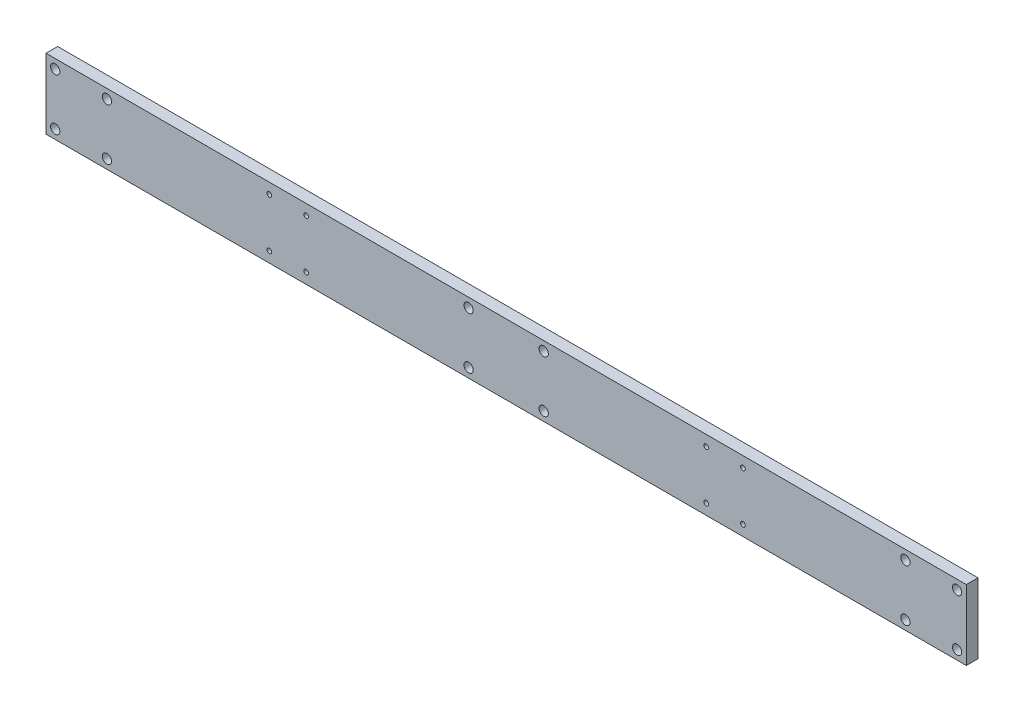
ISO-10303-21;
HEADER;
FILE_DESCRIPTION(('STEP AP214'),'2;1');
FILE_NAME('part.step','',(''),(''),'','','');
FILE_SCHEMA(('AUTOMOTIVE_DESIGN { 1 0 10303 214 1 1 1 1 }'));
ENDSEC;
DATA;
#1=APPLICATION_CONTEXT('core data for automotive mechanical design processes');
#2=APPLICATION_PROTOCOL_DEFINITION('international standard','automotive_design',2000,#1);
#3=PRODUCT_CONTEXT('',#1,'mechanical');
#4=PRODUCT('Part','Part','',(#3));
#5=PRODUCT_RELATED_PRODUCT_CATEGORY('part','',(#4));
#6=PRODUCT_DEFINITION_FORMATION('','',#4);
#7=PRODUCT_DEFINITION_CONTEXT('part definition',#1,'design');
#8=PRODUCT_DEFINITION('design','',#6,#7);
#9=PRODUCT_DEFINITION_SHAPE('','',#8);
#10=(LENGTH_UNIT() NAMED_UNIT(*) SI_UNIT(.MILLI.,.METRE.));
#11=(NAMED_UNIT(*) PLANE_ANGLE_UNIT() SI_UNIT($,.RADIAN.));
#12=(NAMED_UNIT(*) SI_UNIT($,.STERADIAN.) SOLID_ANGLE_UNIT());
#13=UNCERTAINTY_MEASURE_WITH_UNIT(LENGTH_MEASURE(1.E-05),#10,'distance_accuracy_value','');
#14=(GEOMETRIC_REPRESENTATION_CONTEXT(3) GLOBAL_UNCERTAINTY_ASSIGNED_CONTEXT((#13)) GLOBAL_UNIT_ASSIGNED_CONTEXT((#10,
#11,#12)) REPRESENTATION_CONTEXT('',''));
#15=CARTESIAN_POINT('',(0.,0.,0.));
#16=DIRECTION('',(0.,0.,1.));
#17=DIRECTION('',(1.,0.,0.));
#18=AXIS2_PLACEMENT_3D('',#15,#16,#17);
#19=CARTESIAN_POINT('',(500.,38.1,6.35));
#20=DIRECTION('',(-1.,0.,0.));
#21=DIRECTION('',(0.,0.,1.));
#22=AXIS2_PLACEMENT_3D('',#19,#20,#21);
#23=PLANE('',#22);
#24=DIRECTION('',(0.,1.,0.));
#25=VECTOR('',#24,1.);
#26=CARTESIAN_POINT('',(500.,38.1,-6.35));
#27=LINE('',#26,#25);
#28=CARTESIAN_POINT('',(500.,-38.1,-6.35));
#29=VERTEX_POINT('',#28);
#30=CARTESIAN_POINT('',(500.,38.1,-6.35));
#31=VERTEX_POINT('',#30);
#32=EDGE_CURVE('E98',#29,#31,#27,.T.);
#33=ORIENTED_EDGE('',*,*,#32,.T.);
#34=DIRECTION('',(0.,0.,-1.));
#35=VECTOR('',#34,1.);
#36=CARTESIAN_POINT('',(500.,38.1,6.35));
#37=LINE('',#36,#35);
#38=CARTESIAN_POINT('',(500.,38.1,6.35));
#39=VERTEX_POINT('',#38);
#40=EDGE_CURVE('E11',#39,#31,#37,.T.);
#41=ORIENTED_EDGE('',*,*,#40,.F.);
#42=DIRECTION('',(0.,1.,0.));
#43=VECTOR('',#42,1.);
#44=CARTESIAN_POINT('',(500.,38.1,6.35));
#45=LINE('',#44,#43);
#46=CARTESIAN_POINT('',(500.,-38.1,6.35));
#47=VERTEX_POINT('',#46);
#48=EDGE_CURVE('E86',#47,#39,#45,.T.);
#49=ORIENTED_EDGE('',*,*,#48,.F.);
#50=DIRECTION('',(0.,0.,-1.));
#51=VECTOR('',#50,1.);
#52=CARTESIAN_POINT('',(500.,-38.1,6.35));
#53=LINE('',#52,#51);
#54=EDGE_CURVE('E94',#47,#29,#53,.T.);
#55=ORIENTED_EDGE('',*,*,#54,.T.);
#56=EDGE_LOOP('',(#33,#41,#49,#55));
#57=FACE_BOUND('',#56,.T.);
#58=ADVANCED_FACE('F35',(#57),#23,.F.);
#59=CARTESIAN_POINT('',(-500.,38.1,6.35));
#60=DIRECTION('',(0.,-1.,0.));
#61=DIRECTION('',(0.,0.,-1.));
#62=AXIS2_PLACEMENT_3D('',#59,#60,#61);
#63=PLANE('',#62);
#64=DIRECTION('',(-1.,0.,0.));
#65=VECTOR('',#64,1.);
#66=CARTESIAN_POINT('',(-500.,38.1,-6.35));
#67=LINE('',#66,#65);
#68=CARTESIAN_POINT('',(-500.,38.1,-6.35));
#69=VERTEX_POINT('',#68);
#70=EDGE_CURVE('E90',#31,#69,#67,.T.);
#71=ORIENTED_EDGE('',*,*,#70,.T.);
#72=DIRECTION('',(0.,0.,-1.));
#73=VECTOR('',#72,1.);
#74=CARTESIAN_POINT('',(-500.,38.1,6.35));
#75=LINE('',#74,#73);
#76=CARTESIAN_POINT('',(-500.,38.1,6.35));
#77=VERTEX_POINT('',#76);
#78=EDGE_CURVE('E43',#77,#69,#75,.T.);
#79=ORIENTED_EDGE('',*,*,#78,.F.);
#80=DIRECTION('',(-1.,0.,0.));
#81=VECTOR('',#80,1.);
#82=CARTESIAN_POINT('',(-500.,38.1,6.35));
#83=LINE('',#82,#81);
#84=EDGE_CURVE('E81',#39,#77,#83,.T.);
#85=ORIENTED_EDGE('',*,*,#84,.F.);
#86=ORIENTED_EDGE('',*,*,#40,.T.);
#87=EDGE_LOOP('',(#71,#79,#85,#86));
#88=FACE_BOUND('',#87,.T.);
#89=ADVANCED_FACE('F89',(#88),#63,.F.);
#90=CARTESIAN_POINT('',(-500.,38.1,6.35));
#91=DIRECTION('',(1.,0.,0.));
#92=DIRECTION('',(0.,0.,-1.));
#93=AXIS2_PLACEMENT_3D('',#90,#91,#92);
#94=PLANE('',#93);
#95=DIRECTION('',(0.,-1.,0.));
#96=VECTOR('',#95,1.);
#97=CARTESIAN_POINT('',(-500.,38.1,-6.35));
#98=LINE('',#97,#96);
#99=CARTESIAN_POINT('',(-500.,-38.1,-6.35));
#100=VERTEX_POINT('',#99);
#101=EDGE_CURVE('E68',#69,#100,#98,.T.);
#102=ORIENTED_EDGE('',*,*,#101,.T.);
#103=DIRECTION('',(0.,0.,-1.));
#104=VECTOR('',#103,1.);
#105=CARTESIAN_POINT('',(-500.,-38.1,6.35));
#106=LINE('',#105,#104);
#107=CARTESIAN_POINT('',(-500.,-38.1,6.35));
#108=VERTEX_POINT('',#107);
#109=EDGE_CURVE('E91',#108,#100,#106,.T.);
#110=ORIENTED_EDGE('',*,*,#109,.F.);
#111=DIRECTION('',(0.,-1.,0.));
#112=VECTOR('',#111,1.);
#113=CARTESIAN_POINT('',(-500.,38.1,6.35));
#114=LINE('',#113,#112);
#115=EDGE_CURVE('E84',#77,#108,#114,.T.);
#116=ORIENTED_EDGE('',*,*,#115,.F.);
#117=ORIENTED_EDGE('',*,*,#78,.T.);
#118=EDGE_LOOP('',(#102,#110,#116,#117));
#119=FACE_BOUND('',#118,.T.);
#120=ADVANCED_FACE('F92',(#119),#94,.F.);
#121=CARTESIAN_POINT('',(-500.,-38.1,6.35));
#122=DIRECTION('',(0.,1.,0.));
#123=DIRECTION('',(0.,0.,1.));
#124=AXIS2_PLACEMENT_3D('',#121,#122,#123);
#125=PLANE('',#124);
#126=DIRECTION('',(1.,0.,0.));
#127=VECTOR('',#126,1.);
#128=CARTESIAN_POINT('',(-500.,-38.1,-6.35));
#129=LINE('',#128,#127);
#130=EDGE_CURVE('E74',#100,#29,#129,.T.);
#131=ORIENTED_EDGE('',*,*,#130,.T.);
#132=ORIENTED_EDGE('',*,*,#54,.F.);
#133=DIRECTION('',(1.,0.,0.));
#134=VECTOR('',#133,1.);
#135=CARTESIAN_POINT('',(-500.,-38.1,6.35));
#136=LINE('',#135,#134);
#137=EDGE_CURVE('E51',#108,#47,#136,.T.);
#138=ORIENTED_EDGE('',*,*,#137,.F.);
#139=ORIENTED_EDGE('',*,*,#109,.T.);
#140=EDGE_LOOP('',(#131,#132,#138,#139));
#141=FACE_BOUND('',#140,.T.);
#142=ADVANCED_FACE('F106',(#141),#125,.F.);
#143=CARTESIAN_POINT('',(0.,0.,6.35));
#144=DIRECTION('',(0.,0.,1.));
#145=DIRECTION('',(1.,0.,0.));
#146=AXIS2_PLACEMENT_3D('',#143,#144,#145);
#147=PLANE('',#146);
#148=CARTESIAN_POINT('',(-217.300003097746,26.5,6.35));
#149=DIRECTION('',(0.,0.,-1.));
#150=DIRECTION('',(-1.,0.,0.));
#151=AXIS2_PLACEMENT_3D('',#148,#149,#150);
#152=CIRCLE('',#151,2.55269999999999);
#153=CARTESIAN_POINT('',(-219.852703097746,26.5,6.35));
#154=VERTEX_POINT('',#153);
#155=EDGE_CURVE('E225',#154,#154,#152,.T.);
#156=ORIENTED_EDGE('',*,*,#155,.T.);
#157=EDGE_LOOP('',(#156));
#158=FACE_BOUND('',#157,.T.);
#159=CARTESIAN_POINT('',(-257.300003097746,26.5,6.35));
#160=DIRECTION('',(0.,0.,-1.));
#161=DIRECTION('',(-1.,0.,0.));
#162=AXIS2_PLACEMENT_3D('',#159,#160,#161);
#163=CIRCLE('',#162,2.55270000000002);
#164=CARTESIAN_POINT('',(-259.852703097746,26.5,6.35));
#165=VERTEX_POINT('',#164);
#166=EDGE_CURVE('E219',#165,#165,#163,.T.);
#167=ORIENTED_EDGE('',*,*,#166,.T.);
#168=EDGE_LOOP('',(#167));
#169=FACE_BOUND('',#168,.T.);
#170=CARTESIAN_POINT('',(-257.300003097746,-26.5,6.35));
#171=DIRECTION('',(0.,0.,-1.));
#172=DIRECTION('',(-1.,0.,0.));
#173=AXIS2_PLACEMENT_3D('',#170,#171,#172);
#174=CIRCLE('',#173,2.55270000000002);
#175=CARTESIAN_POINT('',(-259.852703097746,-26.5,6.35));
#176=VERTEX_POINT('',#175);
#177=EDGE_CURVE('E213',#176,#176,#174,.T.);
#178=ORIENTED_EDGE('',*,*,#177,.T.);
#179=EDGE_LOOP('',(#178));
#180=FACE_BOUND('',#179,.T.);
#181=CARTESIAN_POINT('',(-217.300003097746,-26.5,6.35));
#182=DIRECTION('',(0.,0.,-1.));
#183=DIRECTION('',(-1.,0.,0.));
#184=AXIS2_PLACEMENT_3D('',#181,#182,#183);
#185=CIRCLE('',#184,2.55269999999999);
#186=CARTESIAN_POINT('',(-219.852703097746,-26.5,6.35));
#187=VERTEX_POINT('',#186);
#188=EDGE_CURVE('E207',#187,#187,#185,.T.);
#189=ORIENTED_EDGE('',*,*,#188,.T.);
#190=EDGE_LOOP('',(#189));
#191=FACE_BOUND('',#190,.T.);
#192=CARTESIAN_POINT('',(257.300003097746,26.5,6.35));
#193=DIRECTION('',(0.,0.,-1.));
#194=DIRECTION('',(-1.,0.,0.));
#195=AXIS2_PLACEMENT_3D('',#192,#193,#194);
#196=CIRCLE('',#195,2.55270000000002);
#197=CARTESIAN_POINT('',(254.747303097746,26.5,6.35));
#198=VERTEX_POINT('',#197);
#199=EDGE_CURVE('E201',#198,#198,#196,.T.);
#200=ORIENTED_EDGE('',*,*,#199,.T.);
#201=EDGE_LOOP('',(#200));
#202=FACE_BOUND('',#201,.T.);
#203=CARTESIAN_POINT('',(257.300003097746,-26.5,6.35));
#204=DIRECTION('',(0.,0.,-1.));
#205=DIRECTION('',(-1.,0.,0.));
#206=AXIS2_PLACEMENT_3D('',#203,#204,#205);
#207=CIRCLE('',#206,2.55270000000002);
#208=CARTESIAN_POINT('',(254.747303097746,-26.5,6.35));
#209=VERTEX_POINT('',#208);
#210=EDGE_CURVE('E195',#209,#209,#207,.T.);
#211=ORIENTED_EDGE('',*,*,#210,.T.);
#212=EDGE_LOOP('',(#211));
#213=FACE_BOUND('',#212,.T.);
#214=CARTESIAN_POINT('',(217.300003097746,-26.5,6.35));
#215=DIRECTION('',(0.,0.,-1.));
#216=DIRECTION('',(-1.,0.,0.));
#217=AXIS2_PLACEMENT_3D('',#214,#215,#216);
#218=CIRCLE('',#217,2.55269999999999);
#219=CARTESIAN_POINT('',(214.747303097746,-26.5,6.35));
#220=VERTEX_POINT('',#219);
#221=EDGE_CURVE('E189',#220,#220,#218,.T.);
#222=ORIENTED_EDGE('',*,*,#221,.T.);
#223=EDGE_LOOP('',(#222));
#224=FACE_BOUND('',#223,.T.);
#225=CARTESIAN_POINT('',(217.300003097746,26.5,6.35));
#226=DIRECTION('',(0.,0.,-1.));
#227=DIRECTION('',(-1.,0.,0.));
#228=AXIS2_PLACEMENT_3D('',#225,#226,#227);
#229=CIRCLE('',#228,2.55269999999999);
#230=CARTESIAN_POINT('',(214.747303097746,26.5,6.35));
#231=VERTEX_POINT('',#230);
#232=EDGE_CURVE('E183',#231,#231,#229,.T.);
#233=ORIENTED_EDGE('',*,*,#232,.T.);
#234=EDGE_LOOP('',(#233));
#235=FACE_BOUND('',#234,.T.);
#236=CARTESIAN_POINT('',(-433.800006231718,28.1000076418459,6.35));
#237=DIRECTION('',(0.,0.,-1.));
#238=DIRECTION('',(-1.,0.,0.));
#239=AXIS2_PLACEMENT_3D('',#236,#237,#238);
#240=CIRCLE('',#239,5.04189999999999);
#241=CARTESIAN_POINT('',(-438.841906231718,28.1000076418459,6.35));
#242=VERTEX_POINT('',#241);
#243=EDGE_CURVE('E177',#242,#242,#240,.T.);
#244=ORIENTED_EDGE('',*,*,#243,.T.);
#245=EDGE_LOOP('',(#244));
#246=FACE_BOUND('',#245,.T.);
#247=CARTESIAN_POINT('',(-490.000006231718,28.1000076418459,6.35));
#248=DIRECTION('',(0.,0.,-1.));
#249=DIRECTION('',(-1.,0.,0.));
#250=AXIS2_PLACEMENT_3D('',#247,#248,#249);
#251=CIRCLE('',#250,5.04189999999999);
#252=CARTESIAN_POINT('',(-495.041906231718,28.1000076418459,6.35));
#253=VERTEX_POINT('',#252);
#254=EDGE_CURVE('E171',#253,#253,#251,.T.);
#255=ORIENTED_EDGE('',*,*,#254,.T.);
#256=EDGE_LOOP('',(#255));
#257=FACE_BOUND('',#256,.T.);
#258=CARTESIAN_POINT('',(-490.000006231718,-28.1000076418459,6.35));
#259=DIRECTION('',(0.,0.,-1.));
#260=DIRECTION('',(-1.,0.,0.));
#261=AXIS2_PLACEMENT_3D('',#258,#259,#260);
#262=CIRCLE('',#261,5.04189999999999);
#263=CARTESIAN_POINT('',(-495.041906231718,-28.1000076418459,6.35));
#264=VERTEX_POINT('',#263);
#265=EDGE_CURVE('E165',#264,#264,#262,.T.);
#266=ORIENTED_EDGE('',*,*,#265,.T.);
#267=EDGE_LOOP('',(#266));
#268=FACE_BOUND('',#267,.T.);
#269=CARTESIAN_POINT('',(-433.800006231718,-28.1000076418459,6.35));
#270=DIRECTION('',(0.,0.,-1.));
#271=DIRECTION('',(-1.,0.,0.));
#272=AXIS2_PLACEMENT_3D('',#269,#270,#271);
#273=CIRCLE('',#272,5.04189999999999);
#274=CARTESIAN_POINT('',(-438.841906231718,-28.1000076418459,6.35));
#275=VERTEX_POINT('',#274);
#276=EDGE_CURVE('E159',#275,#275,#273,.T.);
#277=ORIENTED_EDGE('',*,*,#276,.T.);
#278=EDGE_LOOP('',(#277));
#279=FACE_BOUND('',#278,.T.);
#280=CARTESIAN_POINT('',(433.800006231718,-28.1000076418459,6.35));
#281=DIRECTION('',(0.,0.,-1.));
#282=DIRECTION('',(-1.,0.,0.));
#283=AXIS2_PLACEMENT_3D('',#280,#281,#282);
#284=CIRCLE('',#283,5.04189999999999);
#285=CARTESIAN_POINT('',(428.758106231718,-28.1000076418459,6.35));
#286=VERTEX_POINT('',#285);
#287=EDGE_CURVE('E153',#286,#286,#284,.T.);
#288=ORIENTED_EDGE('',*,*,#287,.T.);
#289=EDGE_LOOP('',(#288));
#290=FACE_BOUND('',#289,.T.);
#291=CARTESIAN_POINT('',(490.000006231718,-28.1000076418459,6.35));
#292=DIRECTION('',(0.,0.,-1.));
#293=DIRECTION('',(-1.,0.,0.));
#294=AXIS2_PLACEMENT_3D('',#291,#292,#293);
#295=CIRCLE('',#294,5.04189999999999);
#296=CARTESIAN_POINT('',(484.958106231718,-28.1000076418459,6.35));
#297=VERTEX_POINT('',#296);
#298=EDGE_CURVE('E147',#297,#297,#295,.T.);
#299=ORIENTED_EDGE('',*,*,#298,.T.);
#300=EDGE_LOOP('',(#299));
#301=FACE_BOUND('',#300,.T.);
#302=CARTESIAN_POINT('',(490.000006231718,28.1000076418459,6.35));
#303=DIRECTION('',(0.,0.,-1.));
#304=DIRECTION('',(-1.,0.,0.));
#305=AXIS2_PLACEMENT_3D('',#302,#303,#304);
#306=CIRCLE('',#305,5.04189999999999);
#307=CARTESIAN_POINT('',(484.958106231718,28.1000076418459,6.35));
#308=VERTEX_POINT('',#307);
#309=EDGE_CURVE('E141',#308,#308,#306,.T.);
#310=ORIENTED_EDGE('',*,*,#309,.T.);
#311=EDGE_LOOP('',(#310));
#312=FACE_BOUND('',#311,.T.);
#313=CARTESIAN_POINT('',(433.800006231718,28.1000076418459,6.35));
#314=DIRECTION('',(0.,0.,-1.));
#315=DIRECTION('',(-1.,0.,0.));
#316=AXIS2_PLACEMENT_3D('',#313,#314,#315);
#317=CIRCLE('',#316,5.04189999999999);
#318=CARTESIAN_POINT('',(428.758106231718,28.1000076418459,6.35));
#319=VERTEX_POINT('',#318);
#320=EDGE_CURVE('E135',#319,#319,#317,.T.);
#321=ORIENTED_EDGE('',*,*,#320,.T.);
#322=EDGE_LOOP('',(#321));
#323=FACE_BOUND('',#322,.T.);
#324=CARTESIAN_POINT('',(-40.7999999637733,28.0999999877301,6.35));
#325=DIRECTION('',(0.,0.,-1.));
#326=DIRECTION('',(-1.,0.,0.));
#327=AXIS2_PLACEMENT_3D('',#324,#325,#326);
#328=CIRCLE('',#327,5.04189999999999);
#329=CARTESIAN_POINT('',(-45.8418999637733,28.0999999877301,6.35));
#330=VERTEX_POINT('',#329);
#331=EDGE_CURVE('E129',#330,#330,#328,.T.);
#332=ORIENTED_EDGE('',*,*,#331,.T.);
#333=EDGE_LOOP('',(#332));
#334=FACE_BOUND('',#333,.T.);
#335=CARTESIAN_POINT('',(-40.7999999637733,-28.0999999877301,6.35));
#336=DIRECTION('',(0.,0.,-1.));
#337=DIRECTION('',(-1.,0.,0.));
#338=AXIS2_PLACEMENT_3D('',#335,#336,#337);
#339=CIRCLE('',#338,5.04189999999999);
#340=CARTESIAN_POINT('',(-45.8418999637733,-28.0999999877301,6.35));
#341=VERTEX_POINT('',#340);
#342=EDGE_CURVE('E123',#341,#341,#339,.T.);
#343=ORIENTED_EDGE('',*,*,#342,.T.);
#344=EDGE_LOOP('',(#343));
#345=FACE_BOUND('',#344,.T.);
#346=CARTESIAN_POINT('',(40.7999999637733,28.0999999877301,6.35));
#347=DIRECTION('',(0.,0.,-1.));
#348=DIRECTION('',(-1.,0.,0.));
#349=AXIS2_PLACEMENT_3D('',#346,#347,#348);
#350=CIRCLE('',#349,5.04189999999999);
#351=CARTESIAN_POINT('',(35.7580999637733,28.0999999877301,6.35));
#352=VERTEX_POINT('',#351);
#353=EDGE_CURVE('E117',#352,#352,#350,.T.);
#354=ORIENTED_EDGE('',*,*,#353,.T.);
#355=EDGE_LOOP('',(#354));
#356=FACE_BOUND('',#355,.T.);
#357=CARTESIAN_POINT('',(40.7999999637733,-28.0999999877301,6.35));
#358=DIRECTION('',(0.,0.,-1.));
#359=DIRECTION('',(-1.,0.,0.));
#360=AXIS2_PLACEMENT_3D('',#357,#358,#359);
#361=CIRCLE('',#360,5.04189999999999);
#362=CARTESIAN_POINT('',(35.7580999637733,-28.0999999877301,6.35));
#363=VERTEX_POINT('',#362);
#364=EDGE_CURVE('E101',#363,#363,#361,.T.);
#365=ORIENTED_EDGE('',*,*,#364,.T.);
#366=EDGE_LOOP('',(#365));
#367=FACE_BOUND('',#366,.T.);
#368=ORIENTED_EDGE('',*,*,#48,.T.);
#369=ORIENTED_EDGE('',*,*,#84,.T.);
#370=ORIENTED_EDGE('',*,*,#115,.T.);
#371=ORIENTED_EDGE('',*,*,#137,.T.);
#372=EDGE_LOOP('',(#368,#369,#370,#371));
#373=FACE_BOUND('',#372,.T.);
#374=ADVANCED_FACE('F82',(#158,#169,#180,#191,#202,#213,#224,#235,#246,#257,#268,#279,#290,#301,
#312,#323,#334,#345,#356,#367,#373),#147,.T.);
#375=CARTESIAN_POINT('',(0.,0.,-6.35));
#376=DIRECTION('',(0.,0.,1.));
#377=DIRECTION('',(1.,0.,0.));
#378=AXIS2_PLACEMENT_3D('',#375,#376,#377);
#379=PLANE('',#378);
#380=CARTESIAN_POINT('',(-217.300003097746,26.5,-6.35));
#381=DIRECTION('',(0.,0.,-1.));
#382=DIRECTION('',(-1.,0.,0.));
#383=AXIS2_PLACEMENT_3D('',#380,#381,#382);
#384=CIRCLE('',#383,2.55269999999999);
#385=CARTESIAN_POINT('',(-219.852703097746,26.5,-6.35));
#386=VERTEX_POINT('',#385);
#387=EDGE_CURVE('E228',#386,#386,#384,.T.);
#388=ORIENTED_EDGE('',*,*,#387,.F.);
#389=EDGE_LOOP('',(#388));
#390=FACE_BOUND('',#389,.T.);
#391=CARTESIAN_POINT('',(-257.300003097746,26.5,-6.35));
#392=DIRECTION('',(0.,0.,-1.));
#393=DIRECTION('',(-1.,0.,0.));
#394=AXIS2_PLACEMENT_3D('',#391,#392,#393);
#395=CIRCLE('',#394,2.55270000000002);
#396=CARTESIAN_POINT('',(-259.852703097746,26.5,-6.35));
#397=VERTEX_POINT('',#396);
#398=EDGE_CURVE('E222',#397,#397,#395,.T.);
#399=ORIENTED_EDGE('',*,*,#398,.F.);
#400=EDGE_LOOP('',(#399));
#401=FACE_BOUND('',#400,.T.);
#402=CARTESIAN_POINT('',(-257.300003097746,-26.5,-6.35));
#403=DIRECTION('',(0.,0.,-1.));
#404=DIRECTION('',(-1.,0.,0.));
#405=AXIS2_PLACEMENT_3D('',#402,#403,#404);
#406=CIRCLE('',#405,2.55270000000002);
#407=CARTESIAN_POINT('',(-259.852703097746,-26.5,-6.35));
#408=VERTEX_POINT('',#407);
#409=EDGE_CURVE('E216',#408,#408,#406,.T.);
#410=ORIENTED_EDGE('',*,*,#409,.F.);
#411=EDGE_LOOP('',(#410));
#412=FACE_BOUND('',#411,.T.);
#413=CARTESIAN_POINT('',(-217.300003097746,-26.5,-6.35));
#414=DIRECTION('',(0.,0.,-1.));
#415=DIRECTION('',(-1.,0.,0.));
#416=AXIS2_PLACEMENT_3D('',#413,#414,#415);
#417=CIRCLE('',#416,2.55269999999999);
#418=CARTESIAN_POINT('',(-219.852703097746,-26.5,-6.35));
#419=VERTEX_POINT('',#418);
#420=EDGE_CURVE('E210',#419,#419,#417,.T.);
#421=ORIENTED_EDGE('',*,*,#420,.F.);
#422=EDGE_LOOP('',(#421));
#423=FACE_BOUND('',#422,.T.);
#424=CARTESIAN_POINT('',(257.300003097746,26.5,-6.35));
#425=DIRECTION('',(0.,0.,-1.));
#426=DIRECTION('',(-1.,0.,0.));
#427=AXIS2_PLACEMENT_3D('',#424,#425,#426);
#428=CIRCLE('',#427,2.55270000000002);
#429=CARTESIAN_POINT('',(254.747303097746,26.5,-6.35));
#430=VERTEX_POINT('',#429);
#431=EDGE_CURVE('E204',#430,#430,#428,.T.);
#432=ORIENTED_EDGE('',*,*,#431,.F.);
#433=EDGE_LOOP('',(#432));
#434=FACE_BOUND('',#433,.T.);
#435=CARTESIAN_POINT('',(257.300003097746,-26.5,-6.35));
#436=DIRECTION('',(0.,0.,-1.));
#437=DIRECTION('',(-1.,0.,0.));
#438=AXIS2_PLACEMENT_3D('',#435,#436,#437);
#439=CIRCLE('',#438,2.55270000000002);
#440=CARTESIAN_POINT('',(254.747303097746,-26.5,-6.35));
#441=VERTEX_POINT('',#440);
#442=EDGE_CURVE('E198',#441,#441,#439,.T.);
#443=ORIENTED_EDGE('',*,*,#442,.F.);
#444=EDGE_LOOP('',(#443));
#445=FACE_BOUND('',#444,.T.);
#446=CARTESIAN_POINT('',(217.300003097746,-26.5,-6.35));
#447=DIRECTION('',(0.,0.,-1.));
#448=DIRECTION('',(-1.,0.,0.));
#449=AXIS2_PLACEMENT_3D('',#446,#447,#448);
#450=CIRCLE('',#449,2.55269999999999);
#451=CARTESIAN_POINT('',(214.747303097746,-26.5,-6.35));
#452=VERTEX_POINT('',#451);
#453=EDGE_CURVE('E192',#452,#452,#450,.T.);
#454=ORIENTED_EDGE('',*,*,#453,.F.);
#455=EDGE_LOOP('',(#454));
#456=FACE_BOUND('',#455,.T.);
#457=CARTESIAN_POINT('',(217.300003097746,26.5,-6.35));
#458=DIRECTION('',(0.,0.,-1.));
#459=DIRECTION('',(-1.,0.,0.));
#460=AXIS2_PLACEMENT_3D('',#457,#458,#459);
#461=CIRCLE('',#460,2.55269999999999);
#462=CARTESIAN_POINT('',(214.747303097746,26.5,-6.35));
#463=VERTEX_POINT('',#462);
#464=EDGE_CURVE('E186',#463,#463,#461,.T.);
#465=ORIENTED_EDGE('',*,*,#464,.F.);
#466=EDGE_LOOP('',(#465));
#467=FACE_BOUND('',#466,.T.);
#468=CARTESIAN_POINT('',(-433.800006231718,28.1000076418459,-6.35));
#469=DIRECTION('',(0.,0.,-1.));
#470=DIRECTION('',(-1.,0.,0.));
#471=AXIS2_PLACEMENT_3D('',#468,#469,#470);
#472=CIRCLE('',#471,5.04189999999999);
#473=CARTESIAN_POINT('',(-438.841906231718,28.1000076418459,-6.35));
#474=VERTEX_POINT('',#473);
#475=EDGE_CURVE('E180',#474,#474,#472,.T.);
#476=ORIENTED_EDGE('',*,*,#475,.F.);
#477=EDGE_LOOP('',(#476));
#478=FACE_BOUND('',#477,.T.);
#479=CARTESIAN_POINT('',(-490.000006231718,28.1000076418459,-6.35));
#480=DIRECTION('',(0.,0.,-1.));
#481=DIRECTION('',(-1.,0.,0.));
#482=AXIS2_PLACEMENT_3D('',#479,#480,#481);
#483=CIRCLE('',#482,5.04189999999999);
#484=CARTESIAN_POINT('',(-495.041906231718,28.1000076418459,-6.35));
#485=VERTEX_POINT('',#484);
#486=EDGE_CURVE('E174',#485,#485,#483,.T.);
#487=ORIENTED_EDGE('',*,*,#486,.F.);
#488=EDGE_LOOP('',(#487));
#489=FACE_BOUND('',#488,.T.);
#490=CARTESIAN_POINT('',(-490.000006231718,-28.1000076418459,-6.35));
#491=DIRECTION('',(0.,0.,-1.));
#492=DIRECTION('',(-1.,0.,0.));
#493=AXIS2_PLACEMENT_3D('',#490,#491,#492);
#494=CIRCLE('',#493,5.04189999999999);
#495=CARTESIAN_POINT('',(-495.041906231718,-28.1000076418459,-6.35));
#496=VERTEX_POINT('',#495);
#497=EDGE_CURVE('E168',#496,#496,#494,.T.);
#498=ORIENTED_EDGE('',*,*,#497,.F.);
#499=EDGE_LOOP('',(#498));
#500=FACE_BOUND('',#499,.T.);
#501=CARTESIAN_POINT('',(-433.800006231718,-28.1000076418459,-6.35));
#502=DIRECTION('',(0.,0.,-1.));
#503=DIRECTION('',(-1.,0.,0.));
#504=AXIS2_PLACEMENT_3D('',#501,#502,#503);
#505=CIRCLE('',#504,5.04189999999999);
#506=CARTESIAN_POINT('',(-438.841906231718,-28.1000076418459,-6.35));
#507=VERTEX_POINT('',#506);
#508=EDGE_CURVE('E162',#507,#507,#505,.T.);
#509=ORIENTED_EDGE('',*,*,#508,.F.);
#510=EDGE_LOOP('',(#509));
#511=FACE_BOUND('',#510,.T.);
#512=CARTESIAN_POINT('',(433.800006231718,-28.1000076418459,-6.35));
#513=DIRECTION('',(0.,0.,-1.));
#514=DIRECTION('',(-1.,0.,0.));
#515=AXIS2_PLACEMENT_3D('',#512,#513,#514);
#516=CIRCLE('',#515,5.04189999999999);
#517=CARTESIAN_POINT('',(428.758106231718,-28.1000076418459,-6.35));
#518=VERTEX_POINT('',#517);
#519=EDGE_CURVE('E156',#518,#518,#516,.T.);
#520=ORIENTED_EDGE('',*,*,#519,.F.);
#521=EDGE_LOOP('',(#520));
#522=FACE_BOUND('',#521,.T.);
#523=CARTESIAN_POINT('',(490.000006231718,-28.1000076418459,-6.35));
#524=DIRECTION('',(0.,0.,-1.));
#525=DIRECTION('',(-1.,0.,0.));
#526=AXIS2_PLACEMENT_3D('',#523,#524,#525);
#527=CIRCLE('',#526,5.04189999999999);
#528=CARTESIAN_POINT('',(484.958106231718,-28.1000076418459,-6.35));
#529=VERTEX_POINT('',#528);
#530=EDGE_CURVE('E150',#529,#529,#527,.T.);
#531=ORIENTED_EDGE('',*,*,#530,.F.);
#532=EDGE_LOOP('',(#531));
#533=FACE_BOUND('',#532,.T.);
#534=CARTESIAN_POINT('',(490.000006231718,28.1000076418459,-6.35));
#535=DIRECTION('',(0.,0.,-1.));
#536=DIRECTION('',(-1.,0.,0.));
#537=AXIS2_PLACEMENT_3D('',#534,#535,#536);
#538=CIRCLE('',#537,5.04189999999999);
#539=CARTESIAN_POINT('',(484.958106231718,28.1000076418459,-6.35));
#540=VERTEX_POINT('',#539);
#541=EDGE_CURVE('E144',#540,#540,#538,.T.);
#542=ORIENTED_EDGE('',*,*,#541,.F.);
#543=EDGE_LOOP('',(#542));
#544=FACE_BOUND('',#543,.T.);
#545=CARTESIAN_POINT('',(433.800006231718,28.1000076418459,-6.35));
#546=DIRECTION('',(0.,0.,-1.));
#547=DIRECTION('',(-1.,0.,0.));
#548=AXIS2_PLACEMENT_3D('',#545,#546,#547);
#549=CIRCLE('',#548,5.04189999999999);
#550=CARTESIAN_POINT('',(428.758106231718,28.1000076418459,-6.35));
#551=VERTEX_POINT('',#550);
#552=EDGE_CURVE('E138',#551,#551,#549,.T.);
#553=ORIENTED_EDGE('',*,*,#552,.F.);
#554=EDGE_LOOP('',(#553));
#555=FACE_BOUND('',#554,.T.);
#556=CARTESIAN_POINT('',(-40.7999999637733,28.0999999877301,-6.35));
#557=DIRECTION('',(0.,0.,-1.));
#558=DIRECTION('',(-1.,0.,0.));
#559=AXIS2_PLACEMENT_3D('',#556,#557,#558);
#560=CIRCLE('',#559,5.04189999999999);
#561=CARTESIAN_POINT('',(-45.8418999637733,28.0999999877301,-6.35));
#562=VERTEX_POINT('',#561);
#563=EDGE_CURVE('E132',#562,#562,#560,.T.);
#564=ORIENTED_EDGE('',*,*,#563,.F.);
#565=EDGE_LOOP('',(#564));
#566=FACE_BOUND('',#565,.T.);
#567=CARTESIAN_POINT('',(-40.7999999637733,-28.0999999877301,-6.35));
#568=DIRECTION('',(0.,0.,-1.));
#569=DIRECTION('',(-1.,0.,0.));
#570=AXIS2_PLACEMENT_3D('',#567,#568,#569);
#571=CIRCLE('',#570,5.04189999999999);
#572=CARTESIAN_POINT('',(-45.8418999637733,-28.0999999877301,-6.35));
#573=VERTEX_POINT('',#572);
#574=EDGE_CURVE('E126',#573,#573,#571,.T.);
#575=ORIENTED_EDGE('',*,*,#574,.F.);
#576=EDGE_LOOP('',(#575));
#577=FACE_BOUND('',#576,.T.);
#578=CARTESIAN_POINT('',(40.7999999637733,28.0999999877301,-6.35));
#579=DIRECTION('',(0.,0.,-1.));
#580=DIRECTION('',(-1.,0.,0.));
#581=AXIS2_PLACEMENT_3D('',#578,#579,#580);
#582=CIRCLE('',#581,5.04189999999999);
#583=CARTESIAN_POINT('',(35.7580999637733,28.0999999877301,-6.35));
#584=VERTEX_POINT('',#583);
#585=EDGE_CURVE('E120',#584,#584,#582,.T.);
#586=ORIENTED_EDGE('',*,*,#585,.F.);
#587=EDGE_LOOP('',(#586));
#588=FACE_BOUND('',#587,.T.);
#589=CARTESIAN_POINT('',(40.7999999637733,-28.0999999877301,-6.35));
#590=DIRECTION('',(0.,0.,-1.));
#591=DIRECTION('',(-1.,0.,0.));
#592=AXIS2_PLACEMENT_3D('',#589,#590,#591);
#593=CIRCLE('',#592,5.04189999999999);
#594=CARTESIAN_POINT('',(35.7580999637733,-28.0999999877301,-6.35));
#595=VERTEX_POINT('',#594);
#596=EDGE_CURVE('E114',#595,#595,#593,.T.);
#597=ORIENTED_EDGE('',*,*,#596,.F.);
#598=EDGE_LOOP('',(#597));
#599=FACE_BOUND('',#598,.T.);
#600=ORIENTED_EDGE('',*,*,#32,.F.);
#601=ORIENTED_EDGE('',*,*,#130,.F.);
#602=ORIENTED_EDGE('',*,*,#101,.F.);
#603=ORIENTED_EDGE('',*,*,#70,.F.);
#604=EDGE_LOOP('',(#600,#601,#602,#603));
#605=FACE_BOUND('',#604,.T.);
#606=ADVANCED_FACE('F109',(#390,#401,#412,#423,#434,#445,#456,#467,#478,#489,#500,#511,#522,
#533,#544,#555,#566,#577,#588,#599,#605),#379,.F.);
#607=CARTESIAN_POINT('',(40.7999999637733,-28.0999999877301,-6.35));
#608=DIRECTION('',(0.,0.,-1.));
#609=DIRECTION('',(-1.,0.,0.));
#610=AXIS2_PLACEMENT_3D('',#607,#608,#609);
#611=CYLINDRICAL_SURFACE('',#610,5.04189999999999);
#612=ORIENTED_EDGE('',*,*,#364,.F.);
#613=EDGE_LOOP('',(#612));
#614=FACE_BOUND('',#613,.T.);
#615=ORIENTED_EDGE('',*,*,#596,.T.);
#616=EDGE_LOOP('',(#615));
#617=FACE_BOUND('',#616,.T.);
#618=ADVANCED_FACE('F236',(#614,#617),#611,.F.);
#619=CARTESIAN_POINT('',(40.7999999637733,28.0999999877301,-6.35));
#620=DIRECTION('',(0.,0.,-1.));
#621=DIRECTION('',(-1.,0.,0.));
#622=AXIS2_PLACEMENT_3D('',#619,#620,#621);
#623=CYLINDRICAL_SURFACE('',#622,5.04189999999999);
#624=ORIENTED_EDGE('',*,*,#353,.F.);
#625=EDGE_LOOP('',(#624));
#626=FACE_BOUND('',#625,.T.);
#627=ORIENTED_EDGE('',*,*,#585,.T.);
#628=EDGE_LOOP('',(#627));
#629=FACE_BOUND('',#628,.T.);
#630=ADVANCED_FACE('F277',(#626,#629),#623,.F.);
#631=CARTESIAN_POINT('',(-40.7999999637733,-28.0999999877301,-6.35));
#632=DIRECTION('',(0.,0.,-1.));
#633=DIRECTION('',(-1.,0.,0.));
#634=AXIS2_PLACEMENT_3D('',#631,#632,#633);
#635=CYLINDRICAL_SURFACE('',#634,5.04189999999999);
#636=ORIENTED_EDGE('',*,*,#342,.F.);
#637=EDGE_LOOP('',(#636));
#638=FACE_BOUND('',#637,.T.);
#639=ORIENTED_EDGE('',*,*,#574,.T.);
#640=EDGE_LOOP('',(#639));
#641=FACE_BOUND('',#640,.T.);
#642=ADVANCED_FACE('F284',(#638,#641),#635,.F.);
#643=CARTESIAN_POINT('',(-40.7999999637733,28.0999999877301,-6.35));
#644=DIRECTION('',(0.,0.,-1.));
#645=DIRECTION('',(-1.,0.,0.));
#646=AXIS2_PLACEMENT_3D('',#643,#644,#645);
#647=CYLINDRICAL_SURFACE('',#646,5.04189999999999);
#648=ORIENTED_EDGE('',*,*,#331,.F.);
#649=EDGE_LOOP('',(#648));
#650=FACE_BOUND('',#649,.T.);
#651=ORIENTED_EDGE('',*,*,#563,.T.);
#652=EDGE_LOOP('',(#651));
#653=FACE_BOUND('',#652,.T.);
#654=ADVANCED_FACE('F346',(#650,#653),#647,.F.);
#655=CARTESIAN_POINT('',(433.800006231718,28.1000076418459,-6.35));
#656=DIRECTION('',(0.,0.,-1.));
#657=DIRECTION('',(-1.,0.,0.));
#658=AXIS2_PLACEMENT_3D('',#655,#656,#657);
#659=CYLINDRICAL_SURFACE('',#658,5.04189999999999);
#660=ORIENTED_EDGE('',*,*,#320,.F.);
#661=EDGE_LOOP('',(#660));
#662=FACE_BOUND('',#661,.T.);
#663=ORIENTED_EDGE('',*,*,#552,.T.);
#664=EDGE_LOOP('',(#663));
#665=FACE_BOUND('',#664,.T.);
#666=ADVANCED_FACE('F351',(#662,#665),#659,.F.);
#667=CARTESIAN_POINT('',(490.000006231718,28.1000076418459,-6.35));
#668=DIRECTION('',(0.,0.,-1.));
#669=DIRECTION('',(-1.,0.,0.));
#670=AXIS2_PLACEMENT_3D('',#667,#668,#669);
#671=CYLINDRICAL_SURFACE('',#670,5.04189999999999);
#672=ORIENTED_EDGE('',*,*,#309,.F.);
#673=EDGE_LOOP('',(#672));
#674=FACE_BOUND('',#673,.T.);
#675=ORIENTED_EDGE('',*,*,#541,.T.);
#676=EDGE_LOOP('',(#675));
#677=FACE_BOUND('',#676,.T.);
#678=ADVANCED_FACE('F357',(#674,#677),#671,.F.);
#679=CARTESIAN_POINT('',(490.000006231718,-28.1000076418459,-6.35));
#680=DIRECTION('',(0.,0.,-1.));
#681=DIRECTION('',(-1.,0.,0.));
#682=AXIS2_PLACEMENT_3D('',#679,#680,#681);
#683=CYLINDRICAL_SURFACE('',#682,5.04189999999999);
#684=ORIENTED_EDGE('',*,*,#298,.F.);
#685=EDGE_LOOP('',(#684));
#686=FACE_BOUND('',#685,.T.);
#687=ORIENTED_EDGE('',*,*,#530,.T.);
#688=EDGE_LOOP('',(#687));
#689=FACE_BOUND('',#688,.T.);
#690=ADVANCED_FACE('F361',(#686,#689),#683,.F.);
#691=CARTESIAN_POINT('',(433.800006231718,-28.1000076418459,-6.35));
#692=DIRECTION('',(0.,0.,-1.));
#693=DIRECTION('',(-1.,0.,0.));
#694=AXIS2_PLACEMENT_3D('',#691,#692,#693);
#695=CYLINDRICAL_SURFACE('',#694,5.04189999999999);
#696=ORIENTED_EDGE('',*,*,#287,.F.);
#697=EDGE_LOOP('',(#696));
#698=FACE_BOUND('',#697,.T.);
#699=ORIENTED_EDGE('',*,*,#519,.T.);
#700=EDGE_LOOP('',(#699));
#701=FACE_BOUND('',#700,.T.);
#702=ADVANCED_FACE('F365',(#698,#701),#695,.F.);
#703=CARTESIAN_POINT('',(-433.800006231718,-28.1000076418459,-6.35));
#704=DIRECTION('',(0.,0.,-1.));
#705=DIRECTION('',(-1.,0.,0.));
#706=AXIS2_PLACEMENT_3D('',#703,#704,#705);
#707=CYLINDRICAL_SURFACE('',#706,5.04189999999999);
#708=ORIENTED_EDGE('',*,*,#276,.F.);
#709=EDGE_LOOP('',(#708));
#710=FACE_BOUND('',#709,.T.);
#711=ORIENTED_EDGE('',*,*,#508,.T.);
#712=EDGE_LOOP('',(#711));
#713=FACE_BOUND('',#712,.T.);
#714=ADVANCED_FACE('F369',(#710,#713),#707,.F.);
#715=CARTESIAN_POINT('',(-490.000006231718,-28.1000076418459,-6.35));
#716=DIRECTION('',(0.,0.,-1.));
#717=DIRECTION('',(-1.,0.,0.));
#718=AXIS2_PLACEMENT_3D('',#715,#716,#717);
#719=CYLINDRICAL_SURFACE('',#718,5.04189999999999);
#720=ORIENTED_EDGE('',*,*,#265,.F.);
#721=EDGE_LOOP('',(#720));
#722=FACE_BOUND('',#721,.T.);
#723=ORIENTED_EDGE('',*,*,#497,.T.);
#724=EDGE_LOOP('',(#723));
#725=FACE_BOUND('',#724,.T.);
#726=ADVANCED_FACE('F373',(#722,#725),#719,.F.);
#727=CARTESIAN_POINT('',(-490.000006231718,28.1000076418459,-6.35));
#728=DIRECTION('',(0.,0.,-1.));
#729=DIRECTION('',(-1.,0.,0.));
#730=AXIS2_PLACEMENT_3D('',#727,#728,#729);
#731=CYLINDRICAL_SURFACE('',#730,5.04189999999999);
#732=ORIENTED_EDGE('',*,*,#254,.F.);
#733=EDGE_LOOP('',(#732));
#734=FACE_BOUND('',#733,.T.);
#735=ORIENTED_EDGE('',*,*,#486,.T.);
#736=EDGE_LOOP('',(#735));
#737=FACE_BOUND('',#736,.T.);
#738=ADVANCED_FACE('F377',(#734,#737),#731,.F.);
#739=CARTESIAN_POINT('',(-433.800006231718,28.1000076418459,-6.35));
#740=DIRECTION('',(0.,0.,-1.));
#741=DIRECTION('',(-1.,0.,0.));
#742=AXIS2_PLACEMENT_3D('',#739,#740,#741);
#743=CYLINDRICAL_SURFACE('',#742,5.04189999999999);
#744=ORIENTED_EDGE('',*,*,#243,.F.);
#745=EDGE_LOOP('',(#744));
#746=FACE_BOUND('',#745,.T.);
#747=ORIENTED_EDGE('',*,*,#475,.T.);
#748=EDGE_LOOP('',(#747));
#749=FACE_BOUND('',#748,.T.);
#750=ADVANCED_FACE('F381',(#746,#749),#743,.F.);
#751=CARTESIAN_POINT('',(217.300003097746,26.5,-6.35));
#752=DIRECTION('',(0.,0.,-1.));
#753=DIRECTION('',(-1.,0.,0.));
#754=AXIS2_PLACEMENT_3D('',#751,#752,#753);
#755=CYLINDRICAL_SURFACE('',#754,2.55269999999999);
#756=ORIENTED_EDGE('',*,*,#232,.F.);
#757=EDGE_LOOP('',(#756));
#758=FACE_BOUND('',#757,.T.);
#759=ORIENTED_EDGE('',*,*,#464,.T.);
#760=EDGE_LOOP('',(#759));
#761=FACE_BOUND('',#760,.T.);
#762=ADVANCED_FACE('F385',(#758,#761),#755,.F.);
#763=CARTESIAN_POINT('',(217.300003097746,-26.5,-6.35));
#764=DIRECTION('',(0.,0.,-1.));
#765=DIRECTION('',(-1.,0.,0.));
#766=AXIS2_PLACEMENT_3D('',#763,#764,#765);
#767=CYLINDRICAL_SURFACE('',#766,2.55269999999999);
#768=ORIENTED_EDGE('',*,*,#221,.F.);
#769=EDGE_LOOP('',(#768));
#770=FACE_BOUND('',#769,.T.);
#771=ORIENTED_EDGE('',*,*,#453,.T.);
#772=EDGE_LOOP('',(#771));
#773=FACE_BOUND('',#772,.T.);
#774=ADVANCED_FACE('F389',(#770,#773),#767,.F.);
#775=CARTESIAN_POINT('',(257.300003097746,-26.5,-6.35));
#776=DIRECTION('',(0.,0.,-1.));
#777=DIRECTION('',(-1.,0.,0.));
#778=AXIS2_PLACEMENT_3D('',#775,#776,#777);
#779=CYLINDRICAL_SURFACE('',#778,2.55270000000002);
#780=ORIENTED_EDGE('',*,*,#210,.F.);
#781=EDGE_LOOP('',(#780));
#782=FACE_BOUND('',#781,.T.);
#783=ORIENTED_EDGE('',*,*,#442,.T.);
#784=EDGE_LOOP('',(#783));
#785=FACE_BOUND('',#784,.T.);
#786=ADVANCED_FACE('F393',(#782,#785),#779,.F.);
#787=CARTESIAN_POINT('',(257.300003097746,26.5,-6.35));
#788=DIRECTION('',(0.,0.,-1.));
#789=DIRECTION('',(-1.,0.,0.));
#790=AXIS2_PLACEMENT_3D('',#787,#788,#789);
#791=CYLINDRICAL_SURFACE('',#790,2.55270000000002);
#792=ORIENTED_EDGE('',*,*,#199,.F.);
#793=EDGE_LOOP('',(#792));
#794=FACE_BOUND('',#793,.T.);
#795=ORIENTED_EDGE('',*,*,#431,.T.);
#796=EDGE_LOOP('',(#795));
#797=FACE_BOUND('',#796,.T.);
#798=ADVANCED_FACE('F397',(#794,#797),#791,.F.);
#799=CARTESIAN_POINT('',(-217.300003097746,-26.5,-6.35));
#800=DIRECTION('',(0.,0.,-1.));
#801=DIRECTION('',(-1.,0.,0.));
#802=AXIS2_PLACEMENT_3D('',#799,#800,#801);
#803=CYLINDRICAL_SURFACE('',#802,2.55269999999999);
#804=ORIENTED_EDGE('',*,*,#188,.F.);
#805=EDGE_LOOP('',(#804));
#806=FACE_BOUND('',#805,.T.);
#807=ORIENTED_EDGE('',*,*,#420,.T.);
#808=EDGE_LOOP('',(#807));
#809=FACE_BOUND('',#808,.T.);
#810=ADVANCED_FACE('F401',(#806,#809),#803,.F.);
#811=CARTESIAN_POINT('',(-257.300003097746,-26.5,-6.35));
#812=DIRECTION('',(0.,0.,-1.));
#813=DIRECTION('',(-1.,0.,0.));
#814=AXIS2_PLACEMENT_3D('',#811,#812,#813);
#815=CYLINDRICAL_SURFACE('',#814,2.55270000000002);
#816=ORIENTED_EDGE('',*,*,#177,.F.);
#817=EDGE_LOOP('',(#816));
#818=FACE_BOUND('',#817,.T.);
#819=ORIENTED_EDGE('',*,*,#409,.T.);
#820=EDGE_LOOP('',(#819));
#821=FACE_BOUND('',#820,.T.);
#822=ADVANCED_FACE('F405',(#818,#821),#815,.F.);
#823=CARTESIAN_POINT('',(-257.300003097746,26.5,-6.35));
#824=DIRECTION('',(0.,0.,-1.));
#825=DIRECTION('',(-1.,0.,0.));
#826=AXIS2_PLACEMENT_3D('',#823,#824,#825);
#827=CYLINDRICAL_SURFACE('',#826,2.55270000000002);
#828=ORIENTED_EDGE('',*,*,#166,.F.);
#829=EDGE_LOOP('',(#828));
#830=FACE_BOUND('',#829,.T.);
#831=ORIENTED_EDGE('',*,*,#398,.T.);
#832=EDGE_LOOP('',(#831));
#833=FACE_BOUND('',#832,.T.);
#834=ADVANCED_FACE('F409',(#830,#833),#827,.F.);
#835=CARTESIAN_POINT('',(-217.300003097746,26.5,-6.35));
#836=DIRECTION('',(0.,0.,-1.));
#837=DIRECTION('',(-1.,0.,0.));
#838=AXIS2_PLACEMENT_3D('',#835,#836,#837);
#839=CYLINDRICAL_SURFACE('',#838,2.55269999999999);
#840=ORIENTED_EDGE('',*,*,#155,.F.);
#841=EDGE_LOOP('',(#840));
#842=FACE_BOUND('',#841,.T.);
#843=ORIENTED_EDGE('',*,*,#387,.T.);
#844=EDGE_LOOP('',(#843));
#845=FACE_BOUND('',#844,.T.);
#846=ADVANCED_FACE('F232',(#842,#845),#839,.F.);
#847=CLOSED_SHELL('',(#58,#89,#120,#142,#374,#606,#618,#630,#642,#654,#666,#678,#690,#702,#714,
#726,#738,#750,#762,#774,#786,#798,#810,#822,#834,#846));
#848=MANIFOLD_SOLID_BREP('B2',#847);
#849=ADVANCED_BREP_SHAPE_REPRESENTATION('',(#18,#848),#14);
#850=SHAPE_DEFINITION_REPRESENTATION(#9,#849);
ENDSEC;
END-ISO-10303-21;
